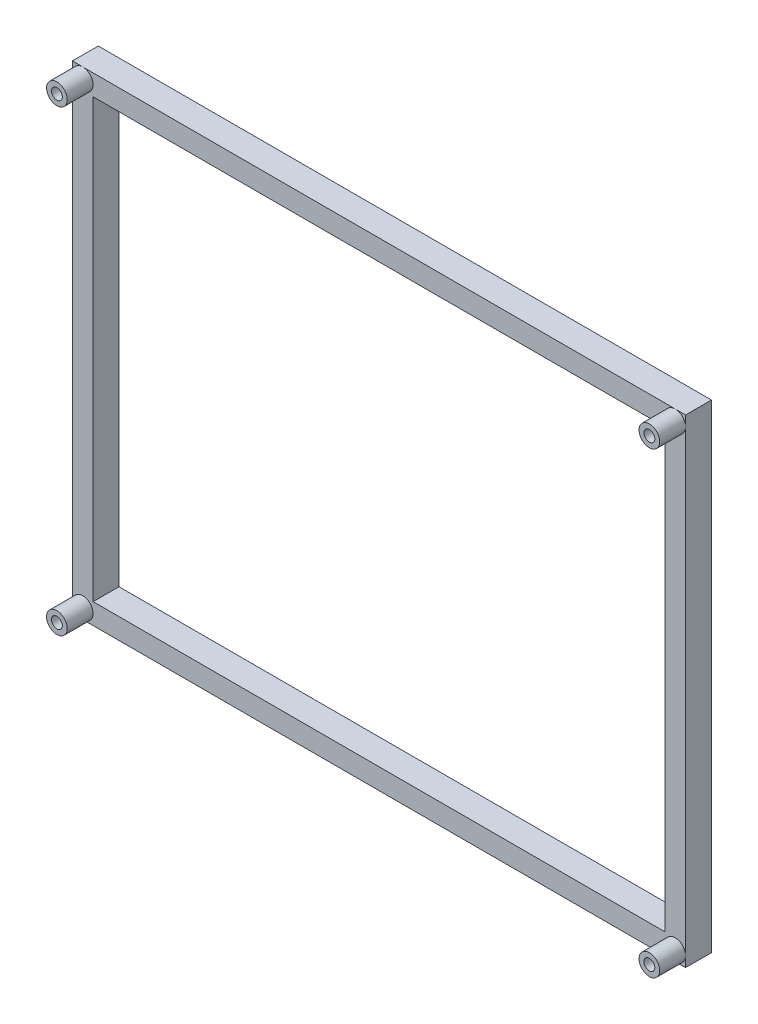
ISO-10303-21;
HEADER;
FILE_DESCRIPTION(('STEP AP214'),'2;1');
FILE_NAME('part.step','',(''),(''),'','','');
FILE_SCHEMA(('AUTOMOTIVE_DESIGN { 1 0 10303 214 1 1 1 1 }'));
ENDSEC;
DATA;
#1=APPLICATION_CONTEXT('core data for automotive mechanical design processes');
#2=APPLICATION_PROTOCOL_DEFINITION('international standard','automotive_design',2000,#1);
#3=PRODUCT_CONTEXT('',#1,'mechanical');
#4=PRODUCT('Part','Part','',(#3));
#5=PRODUCT_RELATED_PRODUCT_CATEGORY('part','',(#4));
#6=PRODUCT_DEFINITION_FORMATION('','',#4);
#7=PRODUCT_DEFINITION_CONTEXT('part definition',#1,'design');
#8=PRODUCT_DEFINITION('design','',#6,#7);
#9=PRODUCT_DEFINITION_SHAPE('','',#8);
#10=(LENGTH_UNIT() NAMED_UNIT(*) SI_UNIT(.MILLI.,.METRE.));
#11=(NAMED_UNIT(*) PLANE_ANGLE_UNIT() SI_UNIT($,.RADIAN.));
#12=(NAMED_UNIT(*) SI_UNIT($,.STERADIAN.) SOLID_ANGLE_UNIT());
#13=UNCERTAINTY_MEASURE_WITH_UNIT(LENGTH_MEASURE(1.E-05),#10,'distance_accuracy_value','');
#14=(GEOMETRIC_REPRESENTATION_CONTEXT(3) GLOBAL_UNCERTAINTY_ASSIGNED_CONTEXT((#13)) GLOBAL_UNIT_ASSIGNED_CONTEXT((#10,
#11,#12)) REPRESENTATION_CONTEXT('',''));
#15=CARTESIAN_POINT('',(0.,0.,0.));
#16=DIRECTION('',(0.,0.,1.));
#17=DIRECTION('',(1.,0.,0.));
#18=AXIS2_PLACEMENT_3D('',#15,#16,#17);
#19=CARTESIAN_POINT('',(0.,0.,0.));
#20=DIRECTION('',(0.,0.,-1.));
#21=DIRECTION('',(-1.,0.,0.));
#22=AXIS2_PLACEMENT_3D('',#19,#20,#21);
#23=PLANE('',#22);
#24=CARTESIAN_POINT('',(2.00000000000001,2.,0.));
#25=DIRECTION('',(0.,0.,1.));
#26=DIRECTION('',(1.,0.,0.));
#27=AXIS2_PLACEMENT_3D('',#24,#25,#26);
#28=CIRCLE('',#27,2.);
#29=CARTESIAN_POINT('',(0.,2.,0.));
#30=VERTEX_POINT('',#29);
#31=CARTESIAN_POINT('',(2.00000000000001,0.,0.));
#32=VERTEX_POINT('',#31);
#33=EDGE_CURVE('E138',#30,#32,#28,.T.);
#34=ORIENTED_EDGE('',*,*,#33,.F.);
#35=DIRECTION('',(0.,-1.,0.));
#36=VECTOR('',#35,1.);
#37=CARTESIAN_POINT('',(0.,0.,0.));
#38=LINE('',#37,#36);
#39=CARTESIAN_POINT('',(0.,0.,0.));
#40=VERTEX_POINT('',#39);
#41=EDGE_CURVE('E127',#30,#40,#38,.T.);
#42=ORIENTED_EDGE('',*,*,#41,.T.);
#43=DIRECTION('',(1.,0.,0.));
#44=VECTOR('',#43,1.);
#45=CARTESIAN_POINT('',(0.,0.,0.));
#46=LINE('',#45,#44);
#47=EDGE_CURVE('E139',#40,#32,#46,.T.);
#48=ORIENTED_EDGE('',*,*,#47,.T.);
#49=EDGE_LOOP('',(#34,#42,#48));
#50=FACE_BOUND('',#49,.T.);
#51=ADVANCED_FACE('F33',(#50),#23,.F.);
#52=CARTESIAN_POINT('',(116.5,2.,0.));
#53=DIRECTION('',(0.,0.,-1.));
#54=DIRECTION('',(-1.,0.,0.));
#55=AXIS2_PLACEMENT_3D('',#52,#53,#54);
#56=CIRCLE('',#55,2.);
#57=CARTESIAN_POINT('',(116.5,0.,0.));
#58=VERTEX_POINT('',#57);
#59=CARTESIAN_POINT('',(118.5,2.,0.));
#60=VERTEX_POINT('',#59);
#61=EDGE_CURVE('E41',#58,#60,#56,.F.);
#62=ORIENTED_EDGE('',*,*,#61,.F.);
#63=CARTESIAN_POINT('',(118.5,0.,0.));
#64=VERTEX_POINT('',#63);
#65=EDGE_CURVE('E299',#58,#64,#46,.T.);
#66=ORIENTED_EDGE('',*,*,#65,.T.);
#67=DIRECTION('',(0.,1.,0.));
#68=VECTOR('',#67,1.);
#69=CARTESIAN_POINT('',(118.5,0.,0.));
#70=LINE('',#69,#68);
#71=EDGE_CURVE('E303',#64,#60,#70,.T.);
#72=ORIENTED_EDGE('',*,*,#71,.T.);
#73=EDGE_LOOP('',(#62,#66,#72));
#74=FACE_BOUND('',#73,.T.);
#75=ADVANCED_FACE('F163',(#74),#23,.F.);
#76=CARTESIAN_POINT('',(116.5,90.5,0.));
#77=DIRECTION('',(0.,0.,1.));
#78=DIRECTION('',(1.,0.,0.));
#79=AXIS2_PLACEMENT_3D('',#76,#77,#78);
#80=CIRCLE('',#79,2.);
#81=CARTESIAN_POINT('',(118.5,90.5,0.));
#82=VERTEX_POINT('',#81);
#83=CARTESIAN_POINT('',(116.5,92.5,0.));
#84=VERTEX_POINT('',#83);
#85=EDGE_CURVE('E234',#82,#84,#80,.T.);
#86=ORIENTED_EDGE('',*,*,#85,.F.);
#87=CARTESIAN_POINT('',(118.5,92.5,0.));
#88=VERTEX_POINT('',#87);
#89=EDGE_CURVE('E301',#82,#88,#70,.T.);
#90=ORIENTED_EDGE('',*,*,#89,.T.);
#91=DIRECTION('',(-1.,0.,0.));
#92=VECTOR('',#91,1.);
#93=CARTESIAN_POINT('',(0.,92.5,0.));
#94=LINE('',#93,#92);
#95=EDGE_CURVE('E290',#88,#84,#94,.T.);
#96=ORIENTED_EDGE('',*,*,#95,.T.);
#97=EDGE_LOOP('',(#86,#90,#96));
#98=FACE_BOUND('',#97,.T.);
#99=ADVANCED_FACE('F168',(#98),#23,.F.);
#100=CARTESIAN_POINT('',(2.00000000000001,90.5,0.));
#101=DIRECTION('',(0.,0.,1.));
#102=DIRECTION('',(1.,0.,0.));
#103=AXIS2_PLACEMENT_3D('',#100,#101,#102);
#104=CIRCLE('',#103,2.);
#105=CARTESIAN_POINT('',(2.00000000000001,92.5,0.));
#106=VERTEX_POINT('',#105);
#107=CARTESIAN_POINT('',(0.,90.5,0.));
#108=VERTEX_POINT('',#107);
#109=EDGE_CURVE('E249',#106,#108,#104,.T.);
#110=ORIENTED_EDGE('',*,*,#109,.F.);
#111=CARTESIAN_POINT('',(0.,92.5,0.));
#112=VERTEX_POINT('',#111);
#113=EDGE_CURVE('E306',#106,#112,#94,.T.);
#114=ORIENTED_EDGE('',*,*,#113,.T.);
#115=EDGE_CURVE('E126',#112,#108,#38,.T.);
#116=ORIENTED_EDGE('',*,*,#115,.T.);
#117=EDGE_LOOP('',(#110,#114,#116));
#118=FACE_BOUND('',#117,.T.);
#119=ADVANCED_FACE('F191',(#118),#23,.F.);
#120=CARTESIAN_POINT('',(0.,0.,-5.));
#121=DIRECTION('',(-1.,0.,0.));
#122=DIRECTION('',(0.,0.,1.));
#123=AXIS2_PLACEMENT_3D('',#120,#121,#122);
#124=PLANE('',#123);
#125=ORIENTED_EDGE('',*,*,#115,.F.);
#126=DIRECTION('',(0.,0.,1.));
#127=VECTOR('',#126,1.);
#128=CARTESIAN_POINT('',(0.,92.5,-5.));
#129=LINE('',#128,#127);
#130=CARTESIAN_POINT('',(0.,92.5,-5.));
#131=VERTEX_POINT('',#130);
#132=EDGE_CURVE('E311',#131,#112,#129,.T.);
#133=ORIENTED_EDGE('',*,*,#132,.F.);
#134=DIRECTION('',(0.,-1.,0.));
#135=VECTOR('',#134,1.);
#136=CARTESIAN_POINT('',(0.,0.,-5.));
#137=LINE('',#136,#135);
#138=CARTESIAN_POINT('',(0.,0.,-5.));
#139=VERTEX_POINT('',#138);
#140=EDGE_CURVE('E287',#131,#139,#137,.T.);
#141=ORIENTED_EDGE('',*,*,#140,.T.);
#142=DIRECTION('',(0.,0.,1.));
#143=VECTOR('',#142,1.);
#144=CARTESIAN_POINT('',(0.,0.,-5.));
#145=LINE('',#144,#143);
#146=EDGE_CURVE('E132',#139,#40,#145,.T.);
#147=ORIENTED_EDGE('',*,*,#146,.T.);
#148=ORIENTED_EDGE('',*,*,#41,.F.);
#149=EDGE_CURVE('E117',#108,#30,#38,.T.);
#150=ORIENTED_EDGE('',*,*,#149,.F.);
#151=EDGE_LOOP('',(#125,#133,#141,#147,#148,#150));
#152=FACE_BOUND('',#151,.T.);
#153=ADVANCED_FACE('F35',(#152),#124,.T.);
#154=CARTESIAN_POINT('',(0.,92.5,-5.));
#155=DIRECTION('',(0.,1.,0.));
#156=DIRECTION('',(0.,0.,1.));
#157=AXIS2_PLACEMENT_3D('',#154,#155,#156);
#158=PLANE('',#157);
#159=ORIENTED_EDGE('',*,*,#95,.F.);
#160=DIRECTION('',(0.,0.,1.));
#161=VECTOR('',#160,1.);
#162=CARTESIAN_POINT('',(118.5,92.5,-5.));
#163=LINE('',#162,#161);
#164=CARTESIAN_POINT('',(118.5,92.5,-5.));
#165=VERTEX_POINT('',#164);
#166=EDGE_CURVE('E314',#165,#88,#163,.T.);
#167=ORIENTED_EDGE('',*,*,#166,.F.);
#168=DIRECTION('',(-1.,0.,0.));
#169=VECTOR('',#168,1.);
#170=CARTESIAN_POINT('',(0.,92.5,-5.));
#171=LINE('',#170,#169);
#172=EDGE_CURVE('E296',#165,#131,#171,.T.);
#173=ORIENTED_EDGE('',*,*,#172,.T.);
#174=ORIENTED_EDGE('',*,*,#132,.T.);
#175=ORIENTED_EDGE('',*,*,#113,.F.);
#176=EDGE_CURVE('E310',#84,#106,#94,.T.);
#177=ORIENTED_EDGE('',*,*,#176,.F.);
#178=EDGE_LOOP('',(#159,#167,#173,#174,#175,#177));
#179=FACE_BOUND('',#178,.T.);
#180=ADVANCED_FACE('F210',(#179),#158,.T.);
#181=CARTESIAN_POINT('',(118.5,0.,-5.));
#182=DIRECTION('',(1.,0.,0.));
#183=DIRECTION('',(0.,0.,-1.));
#184=AXIS2_PLACEMENT_3D('',#181,#182,#183);
#185=PLANE('',#184);
#186=ORIENTED_EDGE('',*,*,#71,.F.);
#187=DIRECTION('',(0.,0.,1.));
#188=VECTOR('',#187,1.);
#189=CARTESIAN_POINT('',(118.5,0.,-5.));
#190=LINE('',#189,#188);
#191=CARTESIAN_POINT('',(118.5,0.,-5.));
#192=VERTEX_POINT('',#191);
#193=EDGE_CURVE('E317',#192,#64,#190,.T.);
#194=ORIENTED_EDGE('',*,*,#193,.F.);
#195=DIRECTION('',(0.,1.,0.));
#196=VECTOR('',#195,1.);
#197=CARTESIAN_POINT('',(118.5,0.,-5.));
#198=LINE('',#197,#196);
#199=EDGE_CURVE('E293',#192,#165,#198,.T.);
#200=ORIENTED_EDGE('',*,*,#199,.T.);
#201=ORIENTED_EDGE('',*,*,#166,.T.);
#202=ORIENTED_EDGE('',*,*,#89,.F.);
#203=EDGE_CURVE('E307',#60,#82,#70,.T.);
#204=ORIENTED_EDGE('',*,*,#203,.F.);
#205=EDGE_LOOP('',(#186,#194,#200,#201,#202,#204));
#206=FACE_BOUND('',#205,.T.);
#207=ADVANCED_FACE('F329',(#206),#185,.T.);
#208=CARTESIAN_POINT('',(0.,0.,-5.));
#209=DIRECTION('',(0.,-1.,0.));
#210=DIRECTION('',(0.,0.,-1.));
#211=AXIS2_PLACEMENT_3D('',#208,#209,#210);
#212=PLANE('',#211);
#213=ORIENTED_EDGE('',*,*,#47,.F.);
#214=ORIENTED_EDGE('',*,*,#146,.F.);
#215=DIRECTION('',(1.,0.,0.));
#216=VECTOR('',#215,1.);
#217=CARTESIAN_POINT('',(0.,0.,-5.));
#218=LINE('',#217,#216);
#219=EDGE_CURVE('E289',#139,#192,#218,.T.);
#220=ORIENTED_EDGE('',*,*,#219,.T.);
#221=ORIENTED_EDGE('',*,*,#193,.T.);
#222=ORIENTED_EDGE('',*,*,#65,.F.);
#223=EDGE_CURVE('E302',#32,#58,#46,.T.);
#224=ORIENTED_EDGE('',*,*,#223,.F.);
#225=EDGE_LOOP('',(#213,#214,#220,#221,#222,#224));
#226=FACE_BOUND('',#225,.T.);
#227=ADVANCED_FACE('F185',(#226),#212,.T.);
#228=CARTESIAN_POINT('',(0.,0.,-5.));
#229=DIRECTION('',(0.,0.,-1.));
#230=DIRECTION('',(-1.,0.,0.));
#231=AXIS2_PLACEMENT_3D('',#228,#229,#230);
#232=PLANE('',#231);
#233=DIRECTION('',(0.,-1.,0.));
#234=VECTOR('',#233,1.);
#235=CARTESIAN_POINT('',(4.00000000000001,88.5,-5.));
#236=LINE('',#235,#234);
#237=CARTESIAN_POINT('',(4.00000000000001,88.5,-5.));
#238=VERTEX_POINT('',#237);
#239=CARTESIAN_POINT('',(4.00000000000001,4.,-5.));
#240=VERTEX_POINT('',#239);
#241=EDGE_CURVE('E257',#238,#240,#236,.T.);
#242=ORIENTED_EDGE('',*,*,#241,.T.);
#243=DIRECTION('',(1.,0.,0.));
#244=VECTOR('',#243,1.);
#245=CARTESIAN_POINT('',(4.00000000000001,4.,-5.));
#246=LINE('',#245,#244);
#247=CARTESIAN_POINT('',(114.5,4.,-5.));
#248=VERTEX_POINT('',#247);
#249=EDGE_CURVE('E260',#240,#248,#246,.T.);
#250=ORIENTED_EDGE('',*,*,#249,.T.);
#251=DIRECTION('',(0.,1.,0.));
#252=VECTOR('',#251,1.);
#253=CARTESIAN_POINT('',(114.5,88.5,-5.));
#254=LINE('',#253,#252);
#255=CARTESIAN_POINT('',(114.5,88.5,-5.));
#256=VERTEX_POINT('',#255);
#257=EDGE_CURVE('E264',#248,#256,#254,.T.);
#258=ORIENTED_EDGE('',*,*,#257,.T.);
#259=DIRECTION('',(-1.,0.,0.));
#260=VECTOR('',#259,1.);
#261=CARTESIAN_POINT('',(4.00000000000001,88.5,-5.));
#262=LINE('',#261,#260);
#263=EDGE_CURVE('E267',#256,#238,#262,.T.);
#264=ORIENTED_EDGE('',*,*,#263,.T.);
#265=EDGE_LOOP('',(#242,#250,#258,#264));
#266=FACE_BOUND('',#265,.T.);
#267=ORIENTED_EDGE('',*,*,#140,.F.);
#268=ORIENTED_EDGE('',*,*,#172,.F.);
#269=ORIENTED_EDGE('',*,*,#199,.F.);
#270=ORIENTED_EDGE('',*,*,#219,.F.);
#271=EDGE_LOOP('',(#267,#268,#269,#270));
#272=FACE_BOUND('',#271,.T.);
#273=ADVANCED_FACE('F176',(#266,#272),#232,.T.);
#274=CARTESIAN_POINT('',(2.00000000000001,2.,0.));
#275=DIRECTION('',(0.,0.,-1.));
#276=DIRECTION('',(-1.,0.,0.));
#277=AXIS2_PLACEMENT_3D('',#274,#275,#276);
#278=CIRCLE('',#277,2.);
#279=EDGE_CURVE('E11',#32,#30,#278,.F.);
#280=ORIENTED_EDGE('',*,*,#279,.F.);
#281=ORIENTED_EDGE('',*,*,#223,.T.);
#282=CARTESIAN_POINT('',(116.5,2.,0.));
#283=DIRECTION('',(0.,0.,1.));
#284=DIRECTION('',(1.,0.,0.));
#285=AXIS2_PLACEMENT_3D('',#282,#283,#284);
#286=CIRCLE('',#285,2.);
#287=EDGE_CURVE('E52',#60,#58,#286,.T.);
#288=ORIENTED_EDGE('',*,*,#287,.F.);
#289=ORIENTED_EDGE('',*,*,#203,.T.);
#290=CARTESIAN_POINT('',(116.5,90.5,0.));
#291=DIRECTION('',(0.,0.,-1.));
#292=DIRECTION('',(-1.,0.,0.));
#293=AXIS2_PLACEMENT_3D('',#290,#291,#292);
#294=CIRCLE('',#293,2.);
#295=EDGE_CURVE('E321',#84,#82,#294,.F.);
#296=ORIENTED_EDGE('',*,*,#295,.F.);
#297=ORIENTED_EDGE('',*,*,#176,.T.);
#298=EDGE_CURVE('E122',#108,#106,#104,.T.);
#299=ORIENTED_EDGE('',*,*,#298,.F.);
#300=ORIENTED_EDGE('',*,*,#149,.T.);
#301=EDGE_LOOP('',(#280,#281,#288,#289,#296,#297,#299,#300));
#302=FACE_BOUND('',#301,.T.);
#303=DIRECTION('',(1.,0.,0.));
#304=VECTOR('',#303,1.);
#305=CARTESIAN_POINT('',(4.00000000000001,4.,0.));
#306=LINE('',#305,#304);
#307=CARTESIAN_POINT('',(4.00000000000001,4.,0.));
#308=VERTEX_POINT('',#307);
#309=CARTESIAN_POINT('',(114.5,4.,0.));
#310=VERTEX_POINT('',#309);
#311=EDGE_CURVE('E272',#308,#310,#306,.T.);
#312=ORIENTED_EDGE('',*,*,#311,.F.);
#313=DIRECTION('',(0.,-1.,0.));
#314=VECTOR('',#313,1.);
#315=CARTESIAN_POINT('',(4.00000000000001,88.5,0.));
#316=LINE('',#315,#314);
#317=CARTESIAN_POINT('',(4.00000000000001,88.5,0.));
#318=VERTEX_POINT('',#317);
#319=EDGE_CURVE('E254',#318,#308,#316,.T.);
#320=ORIENTED_EDGE('',*,*,#319,.F.);
#321=DIRECTION('',(-1.,0.,0.));
#322=VECTOR('',#321,1.);
#323=CARTESIAN_POINT('',(4.00000000000001,88.5,0.));
#324=LINE('',#323,#322);
#325=CARTESIAN_POINT('',(114.5,88.5,0.));
#326=VERTEX_POINT('',#325);
#327=EDGE_CURVE('E261',#326,#318,#324,.T.);
#328=ORIENTED_EDGE('',*,*,#327,.F.);
#329=DIRECTION('',(0.,1.,0.));
#330=VECTOR('',#329,1.);
#331=CARTESIAN_POINT('',(114.5,88.5,0.));
#332=LINE('',#331,#330);
#333=EDGE_CURVE('E275',#310,#326,#332,.T.);
#334=ORIENTED_EDGE('',*,*,#333,.F.);
#335=EDGE_LOOP('',(#312,#320,#328,#334));
#336=FACE_BOUND('',#335,.T.);
#337=ADVANCED_FACE('F119',(#302,#336),#23,.F.);
#338=CARTESIAN_POINT('',(4.00000000000001,88.5,-5.));
#339=DIRECTION('',(-1.,0.,0.));
#340=DIRECTION('',(0.,0.,1.));
#341=AXIS2_PLACEMENT_3D('',#338,#339,#340);
#342=PLANE('',#341);
#343=ORIENTED_EDGE('',*,*,#319,.T.);
#344=DIRECTION('',(0.,0.,1.));
#345=VECTOR('',#344,1.);
#346=CARTESIAN_POINT('',(4.00000000000001,4.,-5.));
#347=LINE('',#346,#345);
#348=EDGE_CURVE('E270',#240,#308,#347,.T.);
#349=ORIENTED_EDGE('',*,*,#348,.F.);
#350=ORIENTED_EDGE('',*,*,#241,.F.);
#351=DIRECTION('',(0.,0.,1.));
#352=VECTOR('',#351,1.);
#353=CARTESIAN_POINT('',(4.00000000000001,88.5,-5.));
#354=LINE('',#353,#352);
#355=EDGE_CURVE('E136',#238,#318,#354,.T.);
#356=ORIENTED_EDGE('',*,*,#355,.T.);
#357=EDGE_LOOP('',(#343,#349,#350,#356));
#358=FACE_BOUND('',#357,.T.);
#359=ADVANCED_FACE('F175',(#358),#342,.F.);
#360=CARTESIAN_POINT('',(4.00000000000001,88.5,-5.));
#361=DIRECTION('',(0.,1.,0.));
#362=DIRECTION('',(0.,0.,1.));
#363=AXIS2_PLACEMENT_3D('',#360,#361,#362);
#364=PLANE('',#363);
#365=ORIENTED_EDGE('',*,*,#327,.T.);
#366=ORIENTED_EDGE('',*,*,#355,.F.);
#367=ORIENTED_EDGE('',*,*,#263,.F.);
#368=DIRECTION('',(0.,0.,1.));
#369=VECTOR('',#368,1.);
#370=CARTESIAN_POINT('',(114.5,88.5,-5.));
#371=LINE('',#370,#369);
#372=EDGE_CURVE('E281',#256,#326,#371,.T.);
#373=ORIENTED_EDGE('',*,*,#372,.T.);
#374=EDGE_LOOP('',(#365,#366,#367,#373));
#375=FACE_BOUND('',#374,.T.);
#376=ADVANCED_FACE('F182',(#375),#364,.F.);
#377=CARTESIAN_POINT('',(114.5,88.5,-5.));
#378=DIRECTION('',(1.,0.,0.));
#379=DIRECTION('',(0.,0.,-1.));
#380=AXIS2_PLACEMENT_3D('',#377,#378,#379);
#381=PLANE('',#380);
#382=ORIENTED_EDGE('',*,*,#333,.T.);
#383=ORIENTED_EDGE('',*,*,#372,.F.);
#384=ORIENTED_EDGE('',*,*,#257,.F.);
#385=DIRECTION('',(0.,0.,1.));
#386=VECTOR('',#385,1.);
#387=CARTESIAN_POINT('',(114.5,4.,-5.));
#388=LINE('',#387,#386);
#389=EDGE_CURVE('E283',#248,#310,#388,.T.);
#390=ORIENTED_EDGE('',*,*,#389,.T.);
#391=EDGE_LOOP('',(#382,#383,#384,#390));
#392=FACE_BOUND('',#391,.T.);
#393=ADVANCED_FACE('F510',(#392),#381,.F.);
#394=CARTESIAN_POINT('',(4.00000000000001,4.,-5.));
#395=DIRECTION('',(0.,-1.,0.));
#396=DIRECTION('',(0.,0.,-1.));
#397=AXIS2_PLACEMENT_3D('',#394,#395,#396);
#398=PLANE('',#397);
#399=ORIENTED_EDGE('',*,*,#311,.T.);
#400=ORIENTED_EDGE('',*,*,#389,.F.);
#401=ORIENTED_EDGE('',*,*,#249,.F.);
#402=ORIENTED_EDGE('',*,*,#348,.T.);
#403=EDGE_LOOP('',(#399,#400,#401,#402));
#404=FACE_BOUND('',#403,.T.);
#405=ADVANCED_FACE('F376',(#404),#398,.F.);
#406=CARTESIAN_POINT('',(2.00000000000001,90.5,5.));
#407=DIRECTION('',(0.,0.,1.));
#408=DIRECTION('',(1.,0.,0.));
#409=AXIS2_PLACEMENT_3D('',#406,#407,#408);
#410=PLANE('',#409);
#411=CARTESIAN_POINT('',(2.00000000000001,90.5,5.));
#412=DIRECTION('',(0.,0.,1.));
#413=DIRECTION('',(1.,0.,0.));
#414=AXIS2_PLACEMENT_3D('',#411,#412,#413);
#415=CIRCLE('',#414,2.);
#416=CARTESIAN_POINT('',(4.00000000000001,90.5,5.));
#417=VERTEX_POINT('',#416);
#418=EDGE_CURVE('E251',#417,#417,#415,.T.);
#419=ORIENTED_EDGE('',*,*,#418,.T.);
#420=EDGE_LOOP('',(#419));
#421=FACE_BOUND('',#420,.T.);
#422=CARTESIAN_POINT('',(2.00000000000001,90.5,5.));
#423=DIRECTION('',(0.,0.,1.));
#424=DIRECTION('',(1.,0.,0.));
#425=AXIS2_PLACEMENT_3D('',#422,#423,#424);
#426=CIRCLE('',#425,1.05);
#427=CARTESIAN_POINT('',(3.05000000000001,90.5,5.));
#428=VERTEX_POINT('',#427);
#429=EDGE_CURVE('E246',#428,#428,#426,.T.);
#430=ORIENTED_EDGE('',*,*,#429,.F.);
#431=EDGE_LOOP('',(#430));
#432=FACE_BOUND('',#431,.T.);
#433=ADVANCED_FACE('F371',(#421,#432),#410,.T.);
#434=CARTESIAN_POINT('',(2.00000000000001,90.5,5.));
#435=DIRECTION('',(0.,0.,-1.));
#436=DIRECTION('',(-1.,0.,0.));
#437=AXIS2_PLACEMENT_3D('',#434,#435,#436);
#438=CYLINDRICAL_SURFACE('',#437,2.);
#439=ORIENTED_EDGE('',*,*,#418,.F.);
#440=EDGE_LOOP('',(#439));
#441=FACE_BOUND('',#440,.T.);
#442=ORIENTED_EDGE('',*,*,#109,.T.);
#443=ORIENTED_EDGE('',*,*,#298,.T.);
#444=EDGE_LOOP('',(#442,#443));
#445=FACE_BOUND('',#444,.T.);
#446=ADVANCED_FACE('F199',(#441,#445),#438,.T.);
#447=CARTESIAN_POINT('',(2.00000000000001,90.5,5.));
#448=DIRECTION('',(0.,0.,-1.));
#449=DIRECTION('',(-1.,0.,0.));
#450=AXIS2_PLACEMENT_3D('',#447,#448,#449);
#451=CYLINDRICAL_SURFACE('',#450,1.05);
#452=ORIENTED_EDGE('',*,*,#429,.T.);
#453=EDGE_LOOP('',(#452));
#454=FACE_BOUND('',#453,.T.);
#455=CARTESIAN_POINT('',(2.00000000000001,90.5,0.));
#456=DIRECTION('',(0.,0.,1.));
#457=DIRECTION('',(1.,0.,0.));
#458=AXIS2_PLACEMENT_3D('',#455,#456,#457);
#459=CIRCLE('',#458,1.05);
#460=CARTESIAN_POINT('',(3.05000000000001,90.5,0.));
#461=VERTEX_POINT('',#460);
#462=EDGE_CURVE('E243',#461,#461,#459,.T.);
#463=ORIENTED_EDGE('',*,*,#462,.F.);
#464=EDGE_LOOP('',(#463));
#465=FACE_BOUND('',#464,.T.);
#466=ADVANCED_FACE('F189',(#454,#465),#451,.F.);
#467=ORIENTED_EDGE('',*,*,#462,.T.);
#468=EDGE_LOOP('',(#467));
#469=FACE_BOUND('',#468,.T.);
#470=ADVANCED_FACE('F177',(#469),#23,.F.);
#471=CARTESIAN_POINT('',(116.5,90.5,5.));
#472=DIRECTION('',(0.,0.,1.));
#473=DIRECTION('',(1.,0.,0.));
#474=AXIS2_PLACEMENT_3D('',#471,#472,#473);
#475=PLANE('',#474);
#476=CARTESIAN_POINT('',(116.5,90.5,5.));
#477=DIRECTION('',(0.,0.,1.));
#478=DIRECTION('',(1.,0.,0.));
#479=AXIS2_PLACEMENT_3D('',#476,#477,#478);
#480=CIRCLE('',#479,2.);
#481=CARTESIAN_POINT('',(118.5,90.5,5.));
#482=VERTEX_POINT('',#481);
#483=EDGE_CURVE('E240',#482,#482,#480,.T.);
#484=ORIENTED_EDGE('',*,*,#483,.T.);
#485=EDGE_LOOP('',(#484));
#486=FACE_BOUND('',#485,.T.);
#487=CARTESIAN_POINT('',(116.5,90.5,5.));
#488=DIRECTION('',(0.,0.,1.));
#489=DIRECTION('',(1.,0.,0.));
#490=AXIS2_PLACEMENT_3D('',#487,#488,#489);
#491=CIRCLE('',#490,1.04999999999999);
#492=CARTESIAN_POINT('',(117.55,90.5,5.));
#493=VERTEX_POINT('',#492);
#494=EDGE_CURVE('E230',#493,#493,#491,.T.);
#495=ORIENTED_EDGE('',*,*,#494,.F.);
#496=EDGE_LOOP('',(#495));
#497=FACE_BOUND('',#496,.T.);
#498=ADVANCED_FACE('F188',(#486,#497),#475,.T.);
#499=CARTESIAN_POINT('',(116.5,90.5,5.));
#500=DIRECTION('',(0.,0.,-1.));
#501=DIRECTION('',(-1.,0.,0.));
#502=AXIS2_PLACEMENT_3D('',#499,#500,#501);
#503=CYLINDRICAL_SURFACE('',#502,2.);
#504=ORIENTED_EDGE('',*,*,#483,.F.);
#505=EDGE_LOOP('',(#504));
#506=FACE_BOUND('',#505,.T.);
#507=ORIENTED_EDGE('',*,*,#85,.T.);
#508=ORIENTED_EDGE('',*,*,#295,.T.);
#509=EDGE_LOOP('',(#507,#508));
#510=FACE_BOUND('',#509,.T.);
#511=ADVANCED_FACE('F196',(#506,#510),#503,.T.);
#512=CARTESIAN_POINT('',(116.5,90.5,5.));
#513=DIRECTION('',(0.,0.,-1.));
#514=DIRECTION('',(-1.,0.,0.));
#515=AXIS2_PLACEMENT_3D('',#512,#513,#514);
#516=CYLINDRICAL_SURFACE('',#515,1.04999999999999);
#517=ORIENTED_EDGE('',*,*,#494,.T.);
#518=EDGE_LOOP('',(#517));
#519=FACE_BOUND('',#518,.T.);
#520=CARTESIAN_POINT('',(116.5,90.5,0.));
#521=DIRECTION('',(0.,0.,1.));
#522=DIRECTION('',(1.,0.,0.));
#523=AXIS2_PLACEMENT_3D('',#520,#521,#522);
#524=CIRCLE('',#523,1.04999999999999);
#525=CARTESIAN_POINT('',(117.55,90.5,0.));
#526=VERTEX_POINT('',#525);
#527=EDGE_CURVE('E228',#526,#526,#524,.T.);
#528=ORIENTED_EDGE('',*,*,#527,.F.);
#529=EDGE_LOOP('',(#528));
#530=FACE_BOUND('',#529,.T.);
#531=ADVANCED_FACE('F215',(#519,#530),#516,.F.);
#532=ORIENTED_EDGE('',*,*,#527,.T.);
#533=EDGE_LOOP('',(#532));
#534=FACE_BOUND('',#533,.T.);
#535=ADVANCED_FACE('F205',(#534),#23,.F.);
#536=CARTESIAN_POINT('',(116.5,2.,5.));
#537=DIRECTION('',(0.,0.,1.));
#538=DIRECTION('',(1.,0.,0.));
#539=AXIS2_PLACEMENT_3D('',#536,#537,#538);
#540=PLANE('',#539);
#541=CARTESIAN_POINT('',(116.5,2.,5.));
#542=DIRECTION('',(0.,0.,1.));
#543=DIRECTION('',(1.,0.,0.));
#544=AXIS2_PLACEMENT_3D('',#541,#542,#543);
#545=CIRCLE('',#544,2.);
#546=CARTESIAN_POINT('',(118.5,2.,5.));
#547=VERTEX_POINT('',#546);
#548=EDGE_CURVE('E231',#547,#547,#545,.T.);
#549=ORIENTED_EDGE('',*,*,#548,.T.);
#550=EDGE_LOOP('',(#549));
#551=FACE_BOUND('',#550,.T.);
#552=CARTESIAN_POINT('',(116.5,2.,5.));
#553=DIRECTION('',(0.,0.,1.));
#554=DIRECTION('',(1.,0.,0.));
#555=AXIS2_PLACEMENT_3D('',#552,#553,#554);
#556=CIRCLE('',#555,1.04999999999999);
#557=CARTESIAN_POINT('',(117.55,2.,5.));
#558=VERTEX_POINT('',#557);
#559=EDGE_CURVE('E555',#558,#558,#556,.T.);
#560=ORIENTED_EDGE('',*,*,#559,.F.);
#561=EDGE_LOOP('',(#560));
#562=FACE_BOUND('',#561,.T.);
#563=ADVANCED_FACE('F214',(#551,#562),#540,.T.);
#564=CARTESIAN_POINT('',(116.5,2.,5.));
#565=DIRECTION('',(0.,0.,-1.));
#566=DIRECTION('',(-1.,0.,0.));
#567=AXIS2_PLACEMENT_3D('',#564,#565,#566);
#568=CYLINDRICAL_SURFACE('',#567,2.);
#569=ORIENTED_EDGE('',*,*,#548,.F.);
#570=EDGE_LOOP('',(#569));
#571=FACE_BOUND('',#570,.T.);
#572=ORIENTED_EDGE('',*,*,#287,.T.);
#573=ORIENTED_EDGE('',*,*,#61,.T.);
#574=EDGE_LOOP('',(#572,#573));
#575=FACE_BOUND('',#574,.T.);
#576=ADVANCED_FACE('F221',(#571,#575),#568,.T.);
#577=CARTESIAN_POINT('',(116.5,2.,5.));
#578=DIRECTION('',(0.,0.,-1.));
#579=DIRECTION('',(-1.,0.,0.));
#580=AXIS2_PLACEMENT_3D('',#577,#578,#579);
#581=CYLINDRICAL_SURFACE('',#580,1.04999999999999);
#582=ORIENTED_EDGE('',*,*,#559,.T.);
#583=EDGE_LOOP('',(#582));
#584=FACE_BOUND('',#583,.T.);
#585=CARTESIAN_POINT('',(116.5,2.,0.));
#586=DIRECTION('',(0.,0.,1.));
#587=DIRECTION('',(1.,0.,0.));
#588=AXIS2_PLACEMENT_3D('',#585,#586,#587);
#589=CIRCLE('',#588,1.04999999999999);
#590=CARTESIAN_POINT('',(117.55,2.,0.));
#591=VERTEX_POINT('',#590);
#592=EDGE_CURVE('E553',#591,#591,#589,.T.);
#593=ORIENTED_EDGE('',*,*,#592,.F.);
#594=EDGE_LOOP('',(#593));
#595=FACE_BOUND('',#594,.T.);
#596=ADVANCED_FACE('F441',(#584,#595),#581,.F.);
#597=ORIENTED_EDGE('',*,*,#592,.T.);
#598=EDGE_LOOP('',(#597));
#599=FACE_BOUND('',#598,.T.);
#600=ADVANCED_FACE('F157',(#599),#23,.F.);
#601=CARTESIAN_POINT('',(2.00000000000001,2.,5.));
#602=DIRECTION('',(0.,0.,1.));
#603=DIRECTION('',(1.,0.,0.));
#604=AXIS2_PLACEMENT_3D('',#601,#602,#603);
#605=PLANE('',#604);
#606=CARTESIAN_POINT('',(2.00000000000001,2.,5.));
#607=DIRECTION('',(0.,0.,1.));
#608=DIRECTION('',(1.,0.,0.));
#609=AXIS2_PLACEMENT_3D('',#606,#607,#608);
#610=CIRCLE('',#609,2.);
#611=CARTESIAN_POINT('',(4.00000000000001,2.,5.));
#612=VERTEX_POINT('',#611);
#613=EDGE_CURVE('E141',#612,#612,#610,.T.);
#614=ORIENTED_EDGE('',*,*,#613,.T.);
#615=EDGE_LOOP('',(#614));
#616=FACE_BOUND('',#615,.T.);
#617=CARTESIAN_POINT('',(2.00000000000001,2.,5.));
#618=DIRECTION('',(0.,0.,1.));
#619=DIRECTION('',(1.,0.,0.));
#620=AXIS2_PLACEMENT_3D('',#617,#618,#619);
#621=CIRCLE('',#620,1.05);
#622=CARTESIAN_POINT('',(3.05000000000001,2.,5.));
#623=VERTEX_POINT('',#622);
#624=EDGE_CURVE('E142',#623,#623,#621,.T.);
#625=ORIENTED_EDGE('',*,*,#624,.F.);
#626=EDGE_LOOP('',(#625));
#627=FACE_BOUND('',#626,.T.);
#628=ADVANCED_FACE('F147',(#616,#627),#605,.T.);
#629=CARTESIAN_POINT('',(2.00000000000001,2.,5.));
#630=DIRECTION('',(0.,0.,-1.));
#631=DIRECTION('',(-1.,0.,0.));
#632=AXIS2_PLACEMENT_3D('',#629,#630,#631);
#633=CYLINDRICAL_SURFACE('',#632,2.);
#634=ORIENTED_EDGE('',*,*,#613,.F.);
#635=EDGE_LOOP('',(#634));
#636=FACE_BOUND('',#635,.T.);
#637=ORIENTED_EDGE('',*,*,#33,.T.);
#638=ORIENTED_EDGE('',*,*,#279,.T.);
#639=EDGE_LOOP('',(#637,#638));
#640=FACE_BOUND('',#639,.T.);
#641=ADVANCED_FACE('F144',(#636,#640),#633,.T.);
#642=CARTESIAN_POINT('',(2.00000000000001,2.,5.));
#643=DIRECTION('',(0.,0.,-1.));
#644=DIRECTION('',(-1.,0.,0.));
#645=AXIS2_PLACEMENT_3D('',#642,#643,#644);
#646=CYLINDRICAL_SURFACE('',#645,1.05);
#647=ORIENTED_EDGE('',*,*,#624,.T.);
#648=EDGE_LOOP('',(#647));
#649=FACE_BOUND('',#648,.T.);
#650=CARTESIAN_POINT('',(2.00000000000001,2.,0.));
#651=DIRECTION('',(0.,0.,1.));
#652=DIRECTION('',(1.,0.,0.));
#653=AXIS2_PLACEMENT_3D('',#650,#651,#652);
#654=CIRCLE('',#653,1.05);
#655=CARTESIAN_POINT('',(3.05000000000001,2.,0.));
#656=VERTEX_POINT('',#655);
#657=EDGE_CURVE('E562',#656,#656,#654,.T.);
#658=ORIENTED_EDGE('',*,*,#657,.F.);
#659=EDGE_LOOP('',(#658));
#660=FACE_BOUND('',#659,.T.);
#661=ADVANCED_FACE('F146',(#649,#660),#646,.F.);
#662=ORIENTED_EDGE('',*,*,#657,.T.);
#663=EDGE_LOOP('',(#662));
#664=FACE_BOUND('',#663,.T.);
#665=ADVANCED_FACE('F154',(#664),#23,.F.);
#666=CLOSED_SHELL('',(#51,#75,#99,#119,#153,#180,#207,#227,#273,#337,#359,#376,#393,#405,#433,
#446,#466,#470,#498,#511,#531,#535,#563,#576,#596,#600,#628,#641,#661,#665));
#667=MANIFOLD_SOLID_BREP('B2',#666);
#668=ADVANCED_BREP_SHAPE_REPRESENTATION('',(#18,#667),#14);
#669=SHAPE_DEFINITION_REPRESENTATION(#9,#668);
ENDSEC;
END-ISO-10303-21;
